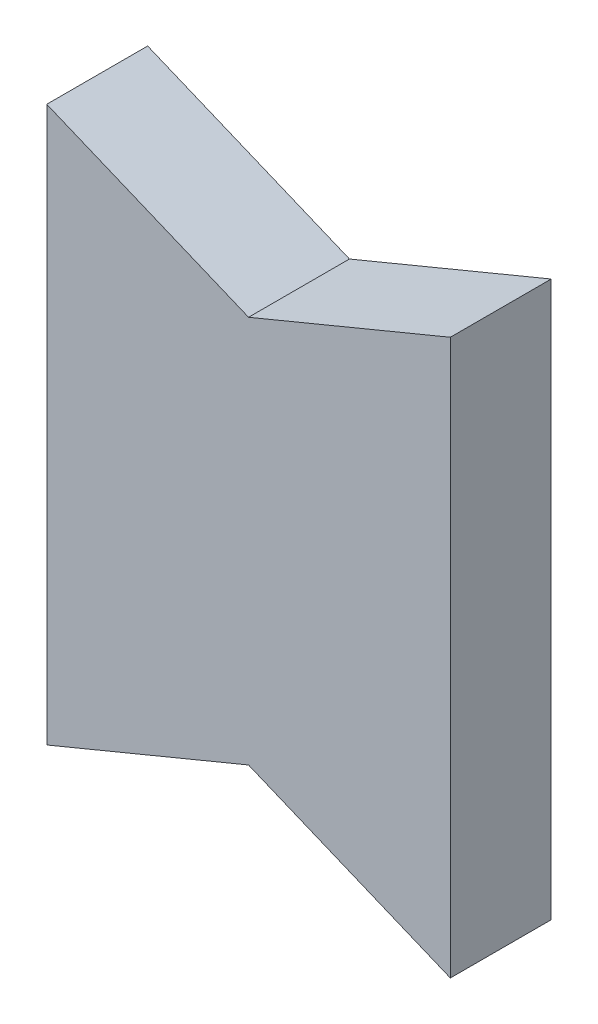
ISO-10303-21;
HEADER;
FILE_DESCRIPTION(('STEP AP214'),'2;1');
FILE_NAME('part.step','',(''),(''),'','','');
FILE_SCHEMA(('AUTOMOTIVE_DESIGN { 1 0 10303 214 1 1 1 1 }'));
ENDSEC;
DATA;
#1=APPLICATION_CONTEXT('core data for automotive mechanical design processes');
#2=APPLICATION_PROTOCOL_DEFINITION('international standard','automotive_design',2000,#1);
#3=PRODUCT_CONTEXT('',#1,'mechanical');
#4=PRODUCT('Part','Part','',(#3));
#5=PRODUCT_RELATED_PRODUCT_CATEGORY('part','',(#4));
#6=PRODUCT_DEFINITION_FORMATION('','',#4);
#7=PRODUCT_DEFINITION_CONTEXT('part definition',#1,'design');
#8=PRODUCT_DEFINITION('design','',#6,#7);
#9=PRODUCT_DEFINITION_SHAPE('','',#8);
#10=(LENGTH_UNIT() NAMED_UNIT(*) SI_UNIT(.MILLI.,.METRE.));
#11=(NAMED_UNIT(*) PLANE_ANGLE_UNIT() SI_UNIT($,.RADIAN.));
#12=(NAMED_UNIT(*) SI_UNIT($,.STERADIAN.) SOLID_ANGLE_UNIT());
#13=UNCERTAINTY_MEASURE_WITH_UNIT(LENGTH_MEASURE(1.E-05),#10,'distance_accuracy_value','');
#14=(GEOMETRIC_REPRESENTATION_CONTEXT(3) GLOBAL_UNCERTAINTY_ASSIGNED_CONTEXT((#13)) GLOBAL_UNIT_ASSIGNED_CONTEXT((#10,
#11,#12)) REPRESENTATION_CONTEXT('',''));
#15=CARTESIAN_POINT('',(0.,0.,0.));
#16=DIRECTION('',(0.,0.,1.));
#17=DIRECTION('',(1.,0.,0.));
#18=AXIS2_PLACEMENT_3D('',#15,#16,#17);
#19=CARTESIAN_POINT('',(0.,-3.8431457505076,2.));
#20=DIRECTION('',(-0.382683432365094,0.923879532511285,0.));
#21=DIRECTION('',(-0.923879532511285,-0.382683432365094,0.));
#22=AXIS2_PLACEMENT_3D('',#19,#20,#21);
#23=PLANE('',#22);
#24=DIRECTION('',(0.923879532511285,0.382683432365094,0.));
#25=VECTOR('',#24,1.);
#26=CARTESIAN_POINT('',(0.,-3.8431457505076,0.));
#27=LINE('',#26,#25);
#28=CARTESIAN_POINT('',(-4.,-5.5,0.));
#29=VERTEX_POINT('',#28);
#30=CARTESIAN_POINT('',(0.,-3.8431457505076,0.));
#31=VERTEX_POINT('',#30);
#32=EDGE_CURVE('E107',#29,#31,#27,.T.);
#33=ORIENTED_EDGE('',*,*,#32,.T.);
#34=DIRECTION('',(0.,0.,-1.));
#35=VECTOR('',#34,1.);
#36=CARTESIAN_POINT('',(0.,-3.8431457505076,2.));
#37=LINE('',#36,#35);
#38=CARTESIAN_POINT('',(0.,-3.8431457505076,2.));
#39=VERTEX_POINT('',#38);
#40=EDGE_CURVE('E11',#39,#31,#37,.T.);
#41=ORIENTED_EDGE('',*,*,#40,.F.);
#42=DIRECTION('',(0.923879532511285,0.382683432365094,0.));
#43=VECTOR('',#42,1.);
#44=CARTESIAN_POINT('',(0.,-3.8431457505076,2.));
#45=LINE('',#44,#43);
#46=CARTESIAN_POINT('',(-4.,-5.5,2.));
#47=VERTEX_POINT('',#46);
#48=EDGE_CURVE('E79',#47,#39,#45,.T.);
#49=ORIENTED_EDGE('',*,*,#48,.F.);
#50=DIRECTION('',(0.,0.,-1.));
#51=VECTOR('',#50,1.);
#52=CARTESIAN_POINT('',(-4.,-5.5,2.));
#53=LINE('',#52,#51);
#54=EDGE_CURVE('E132',#47,#29,#53,.T.);
#55=ORIENTED_EDGE('',*,*,#54,.T.);
#56=EDGE_LOOP('',(#33,#41,#49,#55));
#57=FACE_BOUND('',#56,.T.);
#58=ADVANCED_FACE('F39',(#57),#23,.F.);
#59=CARTESIAN_POINT('',(-4.,5.5,2.));
#60=DIRECTION('',(-0.382683432365094,-0.923879532511285,0.));
#61=DIRECTION('',(0.923879532511285,-0.382683432365094,0.));
#62=AXIS2_PLACEMENT_3D('',#59,#60,#61);
#63=PLANE('',#62);
#64=DIRECTION('',(-0.923879532511285,0.382683432365094,0.));
#65=VECTOR('',#64,1.);
#66=CARTESIAN_POINT('',(-4.,5.5,0.));
#67=LINE('',#66,#65);
#68=CARTESIAN_POINT('',(0.,3.8431457505076,0.));
#69=VERTEX_POINT('',#68);
#70=CARTESIAN_POINT('',(-4.,5.5,0.));
#71=VERTEX_POINT('',#70);
#72=EDGE_CURVE('E69',#69,#71,#67,.T.);
#73=ORIENTED_EDGE('',*,*,#72,.T.);
#74=DIRECTION('',(0.,0.,-1.));
#75=VECTOR('',#74,1.);
#76=CARTESIAN_POINT('',(-4.,5.5,2.));
#77=LINE('',#76,#75);
#78=CARTESIAN_POINT('',(-4.,5.5,2.));
#79=VERTEX_POINT('',#78);
#80=EDGE_CURVE('E137',#79,#71,#77,.T.);
#81=ORIENTED_EDGE('',*,*,#80,.F.);
#82=DIRECTION('',(-0.923879532511285,0.382683432365094,0.));
#83=VECTOR('',#82,1.);
#84=CARTESIAN_POINT('',(-4.,5.5,2.));
#85=LINE('',#84,#83);
#86=CARTESIAN_POINT('',(0.,3.8431457505076,2.));
#87=VERTEX_POINT('',#86);
#88=EDGE_CURVE('E131',#87,#79,#85,.T.);
#89=ORIENTED_EDGE('',*,*,#88,.F.);
#90=DIRECTION('',(0.,0.,-1.));
#91=VECTOR('',#90,1.);
#92=CARTESIAN_POINT('',(0.,3.8431457505076,2.));
#93=LINE('',#92,#91);
#94=EDGE_CURVE('E50',#87,#69,#93,.T.);
#95=ORIENTED_EDGE('',*,*,#94,.T.);
#96=EDGE_LOOP('',(#73,#81,#89,#95));
#97=FACE_BOUND('',#96,.T.);
#98=ADVANCED_FACE('F141',(#97),#63,.F.);
#99=CARTESIAN_POINT('',(-4.,-5.5,2.));
#100=DIRECTION('',(1.,0.,0.));
#101=DIRECTION('',(0.,0.,-1.));
#102=AXIS2_PLACEMENT_3D('',#99,#100,#101);
#103=PLANE('',#102);
#104=DIRECTION('',(0.,-1.,0.));
#105=VECTOR('',#104,1.);
#106=CARTESIAN_POINT('',(-4.,-5.5,0.));
#107=LINE('',#106,#105);
#108=EDGE_CURVE('E74',#71,#29,#107,.T.);
#109=ORIENTED_EDGE('',*,*,#108,.T.);
#110=ORIENTED_EDGE('',*,*,#54,.F.);
#111=DIRECTION('',(0.,-1.,0.));
#112=VECTOR('',#111,1.);
#113=CARTESIAN_POINT('',(-4.,-5.5,2.));
#114=LINE('',#113,#112);
#115=EDGE_CURVE('E54',#79,#47,#114,.T.);
#116=ORIENTED_EDGE('',*,*,#115,.F.);
#117=ORIENTED_EDGE('',*,*,#80,.T.);
#118=EDGE_LOOP('',(#109,#110,#116,#117));
#119=FACE_BOUND('',#118,.T.);
#120=ADVANCED_FACE('F146',(#119),#103,.F.);
#121=CARTESIAN_POINT('',(0.,0.,2.));
#122=DIRECTION('',(0.,0.,-1.));
#123=DIRECTION('',(-1.,0.,0.));
#124=AXIS2_PLACEMENT_3D('',#121,#122,#123);
#125=PLANE('',#124);
#126=ORIENTED_EDGE('',*,*,#48,.T.);
#127=DIRECTION('',(-0.923879532511285,0.382683432365094,0.));
#128=VECTOR('',#127,1.);
#129=CARTESIAN_POINT('',(0.,-3.8431457505076,2.));
#130=LINE('',#129,#128);
#131=CARTESIAN_POINT('',(4.,-5.5,2.));
#132=VERTEX_POINT('',#131);
#133=EDGE_CURVE('E105',#132,#39,#130,.T.);
#134=ORIENTED_EDGE('',*,*,#133,.F.);
#135=DIRECTION('',(0.,-1.,0.));
#136=VECTOR('',#135,1.);
#137=CARTESIAN_POINT('',(4.,-5.5,2.));
#138=LINE('',#137,#136);
#139=CARTESIAN_POINT('',(4.,5.5,2.));
#140=VERTEX_POINT('',#139);
#141=EDGE_CURVE('E113',#140,#132,#138,.T.);
#142=ORIENTED_EDGE('',*,*,#141,.F.);
#143=DIRECTION('',(0.923879532511285,0.382683432365094,0.));
#144=VECTOR('',#143,1.);
#145=CARTESIAN_POINT('',(4.,5.5,2.));
#146=LINE('',#145,#144);
#147=EDGE_CURVE('E119',#87,#140,#146,.T.);
#148=ORIENTED_EDGE('',*,*,#147,.F.);
#149=ORIENTED_EDGE('',*,*,#88,.T.);
#150=ORIENTED_EDGE('',*,*,#115,.T.);
#151=EDGE_LOOP('',(#126,#134,#142,#148,#149,#150));
#152=FACE_BOUND('',#151,.T.);
#153=ADVANCED_FACE('F111',(#152),#125,.F.);
#154=CARTESIAN_POINT('',(0.,0.,0.));
#155=DIRECTION('',(0.,0.,-1.));
#156=DIRECTION('',(-1.,0.,0.));
#157=AXIS2_PLACEMENT_3D('',#154,#155,#156);
#158=PLANE('',#157);
#159=ORIENTED_EDGE('',*,*,#32,.F.);
#160=ORIENTED_EDGE('',*,*,#108,.F.);
#161=ORIENTED_EDGE('',*,*,#72,.F.);
#162=DIRECTION('',(0.923879532511285,0.382683432365094,0.));
#163=VECTOR('',#162,1.);
#164=CARTESIAN_POINT('',(4.,5.5,0.));
#165=LINE('',#164,#163);
#166=CARTESIAN_POINT('',(4.,5.5,0.));
#167=VERTEX_POINT('',#166);
#168=EDGE_CURVE('E120',#69,#167,#165,.T.);
#169=ORIENTED_EDGE('',*,*,#168,.T.);
#170=DIRECTION('',(0.,-1.,0.));
#171=VECTOR('',#170,1.);
#172=CARTESIAN_POINT('',(4.,-5.5,0.));
#173=LINE('',#172,#171);
#174=CARTESIAN_POINT('',(4.,-5.5,0.));
#175=VERTEX_POINT('',#174);
#176=EDGE_CURVE('E124',#167,#175,#173,.T.);
#177=ORIENTED_EDGE('',*,*,#176,.T.);
#178=DIRECTION('',(-0.923879532511285,0.382683432365094,0.));
#179=VECTOR('',#178,1.);
#180=CARTESIAN_POINT('',(0.,-3.8431457505076,0.));
#181=LINE('',#180,#179);
#182=EDGE_CURVE('E101',#175,#31,#181,.T.);
#183=ORIENTED_EDGE('',*,*,#182,.T.);
#184=EDGE_LOOP('',(#159,#160,#161,#169,#177,#183));
#185=FACE_BOUND('',#184,.T.);
#186=ADVANCED_FACE('F147',(#185),#158,.T.);
#187=CARTESIAN_POINT('',(0.,-3.8431457505076,2.));
#188=DIRECTION('',(-0.382683432365094,-0.923879532511285,0.));
#189=DIRECTION('',(0.923879532511285,-0.382683432365094,0.));
#190=AXIS2_PLACEMENT_3D('',#187,#188,#189);
#191=PLANE('',#190);
#192=ORIENTED_EDGE('',*,*,#182,.F.);
#193=DIRECTION('',(0.,0.,-1.));
#194=VECTOR('',#193,1.);
#195=CARTESIAN_POINT('',(4.,-5.5,2.));
#196=LINE('',#195,#194);
#197=EDGE_CURVE('E99',#132,#175,#196,.T.);
#198=ORIENTED_EDGE('',*,*,#197,.F.);
#199=ORIENTED_EDGE('',*,*,#133,.T.);
#200=ORIENTED_EDGE('',*,*,#40,.T.);
#201=EDGE_LOOP('',(#192,#198,#199,#200));
#202=FACE_BOUND('',#201,.T.);
#203=ADVANCED_FACE('F102',(#202),#191,.T.);
#204=CARTESIAN_POINT('',(4.,-5.5,2.));
#205=DIRECTION('',(1.,0.,0.));
#206=DIRECTION('',(0.,0.,-1.));
#207=AXIS2_PLACEMENT_3D('',#204,#205,#206);
#208=PLANE('',#207);
#209=ORIENTED_EDGE('',*,*,#176,.F.);
#210=DIRECTION('',(0.,0.,-1.));
#211=VECTOR('',#210,1.);
#212=CARTESIAN_POINT('',(4.,5.5,2.));
#213=LINE('',#212,#211);
#214=EDGE_CURVE('E109',#140,#167,#213,.T.);
#215=ORIENTED_EDGE('',*,*,#214,.F.);
#216=ORIENTED_EDGE('',*,*,#141,.T.);
#217=ORIENTED_EDGE('',*,*,#197,.T.);
#218=EDGE_LOOP('',(#209,#215,#216,#217));
#219=FACE_BOUND('',#218,.T.);
#220=ADVANCED_FACE('F117',(#219),#208,.T.);
#221=CARTESIAN_POINT('',(4.,5.5,2.));
#222=DIRECTION('',(-0.382683432365094,0.923879532511285,0.));
#223=DIRECTION('',(-0.923879532511285,-0.382683432365094,0.));
#224=AXIS2_PLACEMENT_3D('',#221,#222,#223);
#225=PLANE('',#224);
#226=ORIENTED_EDGE('',*,*,#168,.F.);
#227=ORIENTED_EDGE('',*,*,#94,.F.);
#228=ORIENTED_EDGE('',*,*,#147,.T.);
#229=ORIENTED_EDGE('',*,*,#214,.T.);
#230=EDGE_LOOP('',(#226,#227,#228,#229));
#231=FACE_BOUND('',#230,.T.);
#232=ADVANCED_FACE('F150',(#231),#225,.T.);
#233=CLOSED_SHELL('',(#58,#98,#120,#153,#186,#203,#220,#232));
#234=MANIFOLD_SOLID_BREP('B2',#233);
#235=ADVANCED_BREP_SHAPE_REPRESENTATION('',(#18,#234),#14);
#236=SHAPE_DEFINITION_REPRESENTATION(#9,#235);
ENDSEC;
END-ISO-10303-21;
